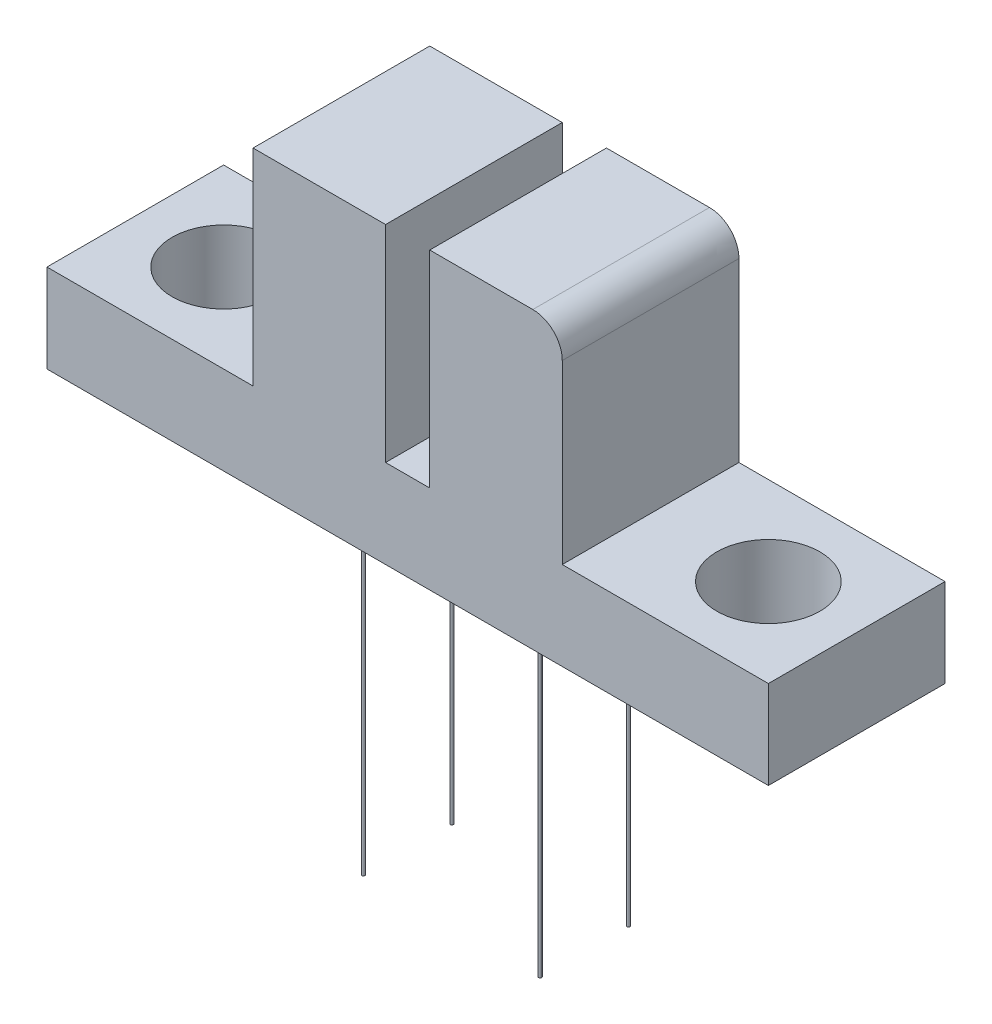
ISO-10303-21;
HEADER;
FILE_DESCRIPTION(('STEP AP214'),'2;1');
FILE_NAME('part.step','',(''),(''),'','','');
FILE_SCHEMA(('AUTOMOTIVE_DESIGN { 1 0 10303 214 1 1 1 1 }'));
ENDSEC;
DATA;
#1=APPLICATION_CONTEXT('core data for automotive mechanical design processes');
#2=APPLICATION_PROTOCOL_DEFINITION('international standard','automotive_design',2000,#1);
#3=PRODUCT_CONTEXT('',#1,'mechanical');
#4=PRODUCT('Part','Part','',(#3));
#5=PRODUCT_RELATED_PRODUCT_CATEGORY('part','',(#4));
#6=PRODUCT_DEFINITION_FORMATION('','',#4);
#7=PRODUCT_DEFINITION_CONTEXT('part definition',#1,'design');
#8=PRODUCT_DEFINITION('design','',#6,#7);
#9=PRODUCT_DEFINITION_SHAPE('','',#8);
#10=(LENGTH_UNIT() NAMED_UNIT(*) SI_UNIT(.MILLI.,.METRE.));
#11=(NAMED_UNIT(*) PLANE_ANGLE_UNIT() SI_UNIT($,.RADIAN.));
#12=(NAMED_UNIT(*) SI_UNIT($,.STERADIAN.) SOLID_ANGLE_UNIT());
#13=UNCERTAINTY_MEASURE_WITH_UNIT(LENGTH_MEASURE(1.E-05),#10,'distance_accuracy_value','');
#14=(GEOMETRIC_REPRESENTATION_CONTEXT(3) GLOBAL_UNCERTAINTY_ASSIGNED_CONTEXT((#13)) GLOBAL_UNIT_ASSIGNED_CONTEXT((#10,
#11,#12)) REPRESENTATION_CONTEXT('',''));
#15=CARTESIAN_POINT('',(0.,0.,0.));
#16=DIRECTION('',(0.,0.,1.));
#17=DIRECTION('',(1.,0.,0.));
#18=AXIS2_PLACEMENT_3D('',#15,#16,#17);
#19=CARTESIAN_POINT('',(0.,3.,0.));
#20=DIRECTION('',(0.,-1.,0.));
#21=DIRECTION('',(0.,0.,-1.));
#22=AXIS2_PLACEMENT_3D('',#19,#20,#21);
#23=PLANE('',#22);
#24=CARTESIAN_POINT('',(-3.,3.,3.));
#25=DIRECTION('',(0.,1.,0.));
#26=DIRECTION('',(0.,0.,-1.));
#27=AXIS2_PLACEMENT_3D('',#24,#25,#26);
#28=CIRCLE('',#27,1.75);
#29=CARTESIAN_POINT('',(-3.,3.,1.25));
#30=VERTEX_POINT('',#29);
#31=EDGE_CURVE('E285',#30,#30,#28,.T.);
#32=ORIENTED_EDGE('',*,*,#31,.F.);
#33=EDGE_LOOP('',(#32));
#34=FACE_BOUND('',#33,.T.);
#35=DIRECTION('',(0.,0.,-1.));
#36=VECTOR('',#35,1.);
#37=CARTESIAN_POINT('',(-7.00000000000001,3.,0.));
#38=LINE('',#37,#36);
#39=CARTESIAN_POINT('',(-7.00000000000001,3.,6.));
#40=VERTEX_POINT('',#39);
#41=CARTESIAN_POINT('',(-7.00000000000001,3.,0.));
#42=VERTEX_POINT('',#41);
#43=EDGE_CURVE('E179',#40,#42,#38,.T.);
#44=ORIENTED_EDGE('',*,*,#43,.F.);
#45=DIRECTION('',(1.,0.,0.));
#46=VECTOR('',#45,1.);
#47=CARTESIAN_POINT('',(0.,3.,6.));
#48=LINE('',#47,#46);
#49=CARTESIAN_POINT('',(0.,3.,6.));
#50=VERTEX_POINT('',#49);
#51=EDGE_CURVE('E307',#40,#50,#48,.T.);
#52=ORIENTED_EDGE('',*,*,#51,.T.);
#53=DIRECTION('',(0.,0.,-1.));
#54=VECTOR('',#53,1.);
#55=CARTESIAN_POINT('',(0.,3.,0.));
#56=LINE('',#55,#54);
#57=CARTESIAN_POINT('',(0.,3.,0.));
#58=VERTEX_POINT('',#57);
#59=EDGE_CURVE('E297',#50,#58,#56,.T.);
#60=ORIENTED_EDGE('',*,*,#59,.T.);
#61=DIRECTION('',(-1.,0.,0.));
#62=VECTOR('',#61,1.);
#63=CARTESIAN_POINT('',(0.,3.,0.));
#64=LINE('',#63,#62);
#65=EDGE_CURVE('E302',#58,#42,#64,.T.);
#66=ORIENTED_EDGE('',*,*,#65,.T.);
#67=EDGE_LOOP('',(#44,#52,#60,#66));
#68=FACE_BOUND('',#67,.T.);
#69=ADVANCED_FACE('F43',(#34,#68),#23,.F.);
#70=DIRECTION('',(0.,0.,1.));
#71=VECTOR('',#70,1.);
#72=CARTESIAN_POINT('',(-11.5,3.,0.));
#73=LINE('',#72,#71);
#74=CARTESIAN_POINT('',(-11.5,3.,0.));
#75=VERTEX_POINT('',#74);
#76=CARTESIAN_POINT('',(-11.5,3.,6.));
#77=VERTEX_POINT('',#76);
#78=EDGE_CURVE('E153',#75,#77,#73,.T.);
#79=ORIENTED_EDGE('',*,*,#78,.F.);
#80=CARTESIAN_POINT('',(-13.,3.,0.));
#81=VERTEX_POINT('',#80);
#82=EDGE_CURVE('E160',#75,#81,#64,.T.);
#83=ORIENTED_EDGE('',*,*,#82,.T.);
#84=DIRECTION('',(0.,0.,-1.));
#85=VECTOR('',#84,1.);
#86=CARTESIAN_POINT('',(-13.,3.,0.));
#87=LINE('',#86,#85);
#88=CARTESIAN_POINT('',(-13.,3.,6.));
#89=VERTEX_POINT('',#88);
#90=EDGE_CURVE('E262',#89,#81,#87,.T.);
#91=ORIENTED_EDGE('',*,*,#90,.F.);
#92=EDGE_CURVE('E311',#89,#77,#48,.T.);
#93=ORIENTED_EDGE('',*,*,#92,.T.);
#94=EDGE_LOOP('',(#79,#83,#91,#93));
#95=FACE_BOUND('',#94,.T.);
#96=ADVANCED_FACE('F347',(#95),#23,.F.);
#97=CARTESIAN_POINT('',(-21.5,3.,3.));
#98=DIRECTION('',(0.,1.,0.));
#99=DIRECTION('',(0.,0.,1.));
#100=AXIS2_PLACEMENT_3D('',#97,#98,#99);
#101=CIRCLE('',#100,1.75);
#102=CARTESIAN_POINT('',(-21.5,3.,4.75));
#103=VERTEX_POINT('',#102);
#104=EDGE_CURVE('E291',#103,#103,#101,.T.);
#105=ORIENTED_EDGE('',*,*,#104,.F.);
#106=EDGE_LOOP('',(#105));
#107=FACE_BOUND('',#106,.T.);
#108=DIRECTION('',(0.,0.,1.));
#109=VECTOR('',#108,1.);
#110=CARTESIAN_POINT('',(-17.5,3.,0.));
#111=LINE('',#110,#109);
#112=CARTESIAN_POINT('',(-17.5,3.,0.));
#113=VERTEX_POINT('',#112);
#114=CARTESIAN_POINT('',(-17.5,3.,6.));
#115=VERTEX_POINT('',#114);
#116=EDGE_CURVE('E269',#113,#115,#111,.T.);
#117=ORIENTED_EDGE('',*,*,#116,.F.);
#118=CARTESIAN_POINT('',(-24.5,3.,0.));
#119=VERTEX_POINT('',#118);
#120=EDGE_CURVE('E300',#113,#119,#64,.T.);
#121=ORIENTED_EDGE('',*,*,#120,.T.);
#122=DIRECTION('',(0.,0.,1.));
#123=VECTOR('',#122,1.);
#124=CARTESIAN_POINT('',(-24.5,3.,0.));
#125=LINE('',#124,#123);
#126=CARTESIAN_POINT('',(-24.5,3.,6.));
#127=VERTEX_POINT('',#126);
#128=EDGE_CURVE('E305',#119,#127,#125,.T.);
#129=ORIENTED_EDGE('',*,*,#128,.T.);
#130=EDGE_CURVE('E308',#127,#115,#48,.T.);
#131=ORIENTED_EDGE('',*,*,#130,.T.);
#132=EDGE_LOOP('',(#117,#121,#129,#131));
#133=FACE_BOUND('',#132,.T.);
#134=ADVANCED_FACE('F343',(#107,#133),#23,.F.);
#135=CARTESIAN_POINT('',(0.,0.,0.));
#136=DIRECTION('',(0.,-1.,0.));
#137=DIRECTION('',(0.,0.,-1.));
#138=AXIS2_PLACEMENT_3D('',#135,#136,#137);
#139=PLANE('',#138);
#140=CARTESIAN_POINT('',(-9.25000000000001,0.,1.5));
#141=DIRECTION('',(0.,-1.,0.));
#142=DIRECTION('',(0.,0.,-1.));
#143=AXIS2_PLACEMENT_3D('',#140,#141,#142);
#144=CIRCLE('',#143,0.0499999999999988);
#145=CARTESIAN_POINT('',(-9.25000000000001,0.,1.45));
#146=VERTEX_POINT('',#145);
#147=EDGE_CURVE('E533',#146,#146,#144,.T.);
#148=ORIENTED_EDGE('',*,*,#147,.F.);
#149=EDGE_LOOP('',(#148));
#150=FACE_BOUND('',#149,.T.);
#151=CARTESIAN_POINT('',(-9.25000000000001,0.,4.5));
#152=DIRECTION('',(0.,-1.,0.));
#153=DIRECTION('',(0.,0.,1.));
#154=AXIS2_PLACEMENT_3D('',#151,#152,#153);
#155=CIRCLE('',#154,0.0499999999999988);
#156=CARTESIAN_POINT('',(-9.25000000000001,0.,4.55));
#157=VERTEX_POINT('',#156);
#158=EDGE_CURVE('E532',#157,#157,#155,.T.);
#159=ORIENTED_EDGE('',*,*,#158,.F.);
#160=EDGE_LOOP('',(#159));
#161=FACE_BOUND('',#160,.T.);
#162=CARTESIAN_POINT('',(-15.25,0.,4.5));
#163=DIRECTION('',(0.,-1.,0.));
#164=DIRECTION('',(0.,0.,-1.));
#165=AXIS2_PLACEMENT_3D('',#162,#163,#164);
#166=CIRCLE('',#165,0.0499999999999988);
#167=CARTESIAN_POINT('',(-15.25,0.,4.45));
#168=VERTEX_POINT('',#167);
#169=EDGE_CURVE('E542',#168,#168,#166,.T.);
#170=ORIENTED_EDGE('',*,*,#169,.F.);
#171=EDGE_LOOP('',(#170));
#172=FACE_BOUND('',#171,.T.);
#173=CARTESIAN_POINT('',(-15.25,0.,1.5));
#174=DIRECTION('',(0.,-1.,0.));
#175=DIRECTION('',(0.,0.,1.));
#176=AXIS2_PLACEMENT_3D('',#173,#174,#175);
#177=CIRCLE('',#176,0.0499999999999988);
#178=CARTESIAN_POINT('',(-15.25,0.,1.55));
#179=VERTEX_POINT('',#178);
#180=EDGE_CURVE('E547',#179,#179,#177,.T.);
#181=ORIENTED_EDGE('',*,*,#180,.F.);
#182=EDGE_LOOP('',(#181));
#183=FACE_BOUND('',#182,.T.);
#184=CARTESIAN_POINT('',(-21.5,0.,3.));
#185=DIRECTION('',(0.,1.,0.));
#186=DIRECTION('',(0.,0.,1.));
#187=AXIS2_PLACEMENT_3D('',#184,#185,#186);
#188=CIRCLE('',#187,1.75);
#189=CARTESIAN_POINT('',(-21.5,0.,4.75));
#190=VERTEX_POINT('',#189);
#191=EDGE_CURVE('E288',#190,#190,#188,.T.);
#192=ORIENTED_EDGE('',*,*,#191,.T.);
#193=EDGE_LOOP('',(#192));
#194=FACE_BOUND('',#193,.T.);
#195=DIRECTION('',(0.,0.,-1.));
#196=VECTOR('',#195,1.);
#197=CARTESIAN_POINT('',(0.,0.,0.));
#198=LINE('',#197,#196);
#199=CARTESIAN_POINT('',(0.,0.,6.));
#200=VERTEX_POINT('',#199);
#201=CARTESIAN_POINT('',(0.,0.,0.));
#202=VERTEX_POINT('',#201);
#203=EDGE_CURVE('E294',#200,#202,#198,.T.);
#204=ORIENTED_EDGE('',*,*,#203,.F.);
#205=DIRECTION('',(1.,0.,0.));
#206=VECTOR('',#205,1.);
#207=CARTESIAN_POINT('',(0.,0.,6.));
#208=LINE('',#207,#206);
#209=CARTESIAN_POINT('',(-24.5,0.,6.));
#210=VERTEX_POINT('',#209);
#211=EDGE_CURVE('E301',#210,#200,#208,.T.);
#212=ORIENTED_EDGE('',*,*,#211,.F.);
#213=DIRECTION('',(0.,0.,1.));
#214=VECTOR('',#213,1.);
#215=CARTESIAN_POINT('',(-24.5,0.,0.));
#216=LINE('',#215,#214);
#217=CARTESIAN_POINT('',(-24.5,0.,0.));
#218=VERTEX_POINT('',#217);
#219=EDGE_CURVE('E316',#218,#210,#216,.T.);
#220=ORIENTED_EDGE('',*,*,#219,.F.);
#221=DIRECTION('',(-1.,0.,0.));
#222=VECTOR('',#221,1.);
#223=CARTESIAN_POINT('',(0.,0.,0.));
#224=LINE('',#223,#222);
#225=EDGE_CURVE('E314',#202,#218,#224,.T.);
#226=ORIENTED_EDGE('',*,*,#225,.F.);
#227=EDGE_LOOP('',(#204,#212,#220,#226));
#228=FACE_BOUND('',#227,.T.);
#229=CARTESIAN_POINT('',(-3.,0.,3.));
#230=DIRECTION('',(0.,1.,0.));
#231=DIRECTION('',(0.,0.,-1.));
#232=AXIS2_PLACEMENT_3D('',#229,#230,#231);
#233=CIRCLE('',#232,1.75);
#234=CARTESIAN_POINT('',(-3.,0.,1.25));
#235=VERTEX_POINT('',#234);
#236=EDGE_CURVE('E284',#235,#235,#233,.T.);
#237=ORIENTED_EDGE('',*,*,#236,.T.);
#238=EDGE_LOOP('',(#237));
#239=FACE_BOUND('',#238,.T.);
#240=ADVANCED_FACE('F237',(#150,#161,#172,#183,#194,#228,#239),#139,.T.);
#241=CARTESIAN_POINT('',(0.,3.,0.));
#242=DIRECTION('',(-1.,0.,0.));
#243=DIRECTION('',(0.,0.,1.));
#244=AXIS2_PLACEMENT_3D('',#241,#242,#243);
#245=PLANE('',#244);
#246=ORIENTED_EDGE('',*,*,#203,.T.);
#247=DIRECTION('',(0.,-1.,0.));
#248=VECTOR('',#247,1.);
#249=CARTESIAN_POINT('',(0.,3.,0.));
#250=LINE('',#249,#248);
#251=EDGE_CURVE('E326',#58,#202,#250,.T.);
#252=ORIENTED_EDGE('',*,*,#251,.F.);
#253=ORIENTED_EDGE('',*,*,#59,.F.);
#254=DIRECTION('',(0.,-1.,0.));
#255=VECTOR('',#254,1.);
#256=CARTESIAN_POINT('',(0.,3.,6.));
#257=LINE('',#256,#255);
#258=EDGE_CURVE('E310',#50,#200,#257,.T.);
#259=ORIENTED_EDGE('',*,*,#258,.T.);
#260=EDGE_LOOP('',(#246,#252,#253,#259));
#261=FACE_BOUND('',#260,.T.);
#262=ADVANCED_FACE('F244',(#261),#245,.F.);
#263=CARTESIAN_POINT('',(0.,3.,0.));
#264=DIRECTION('',(0.,0.,1.));
#265=DIRECTION('',(1.,0.,0.));
#266=AXIS2_PLACEMENT_3D('',#263,#264,#265);
#267=PLANE('',#266);
#268=DIRECTION('',(-1.,0.,0.));
#269=VECTOR('',#268,1.);
#270=CARTESIAN_POINT('',(-7.00000000000001,10.,0.));
#271=LINE('',#270,#269);
#272=CARTESIAN_POINT('',(-8.00000000000001,10.,0.));
#273=VERTEX_POINT('',#272);
#274=CARTESIAN_POINT('',(-11.5,10.,0.));
#275=VERTEX_POINT('',#274);
#276=EDGE_CURVE('E143',#273,#275,#271,.T.);
#277=ORIENTED_EDGE('',*,*,#276,.F.);
#278=CARTESIAN_POINT('',(-7.00000000000001,9.,0.));
#279=CARTESIAN_POINT('',(-7.00000000000001,10.,0.));
#280=CARTESIAN_POINT('',(-8.00000000000001,10.,0.));
#281=(BOUNDED_CURVE() B_SPLINE_CURVE(2,(#278,#279,#280),.UNSPECIFIED.,.F.,
.F.) B_SPLINE_CURVE_WITH_KNOTS((3,3),(0.,1.),
.UNSPECIFIED.) CURVE() GEOMETRIC_REPRESENTATION_ITEM() RATIONAL_B_SPLINE_CURVE((1.,
0.707106781186548,1.)) REPRESENTATION_ITEM(''));
#282=CARTESIAN_POINT('',(-7.00000000000001,9.,0.));
#283=VERTEX_POINT('',#282);
#284=EDGE_CURVE('E72',#273,#283,#281,.F.);
#285=ORIENTED_EDGE('',*,*,#284,.T.);
#286=DIRECTION('',(0.,-1.,0.));
#287=VECTOR('',#286,1.);
#288=CARTESIAN_POINT('',(-7.00000000000001,10.,0.));
#289=LINE('',#288,#287);
#290=EDGE_CURVE('E163',#283,#42,#289,.T.);
#291=ORIENTED_EDGE('',*,*,#290,.T.);
#292=ORIENTED_EDGE('',*,*,#65,.F.);
#293=ORIENTED_EDGE('',*,*,#251,.T.);
#294=ORIENTED_EDGE('',*,*,#225,.T.);
#295=DIRECTION('',(0.,-1.,0.));
#296=VECTOR('',#295,1.);
#297=CARTESIAN_POINT('',(-24.5,3.,0.));
#298=LINE('',#297,#296);
#299=EDGE_CURVE('E324',#119,#218,#298,.T.);
#300=ORIENTED_EDGE('',*,*,#299,.F.);
#301=ORIENTED_EDGE('',*,*,#120,.F.);
#302=DIRECTION('',(0.,-1.,0.));
#303=VECTOR('',#302,1.);
#304=CARTESIAN_POINT('',(-17.5,10.,0.));
#305=LINE('',#304,#303);
#306=CARTESIAN_POINT('',(-17.5,10.,0.));
#307=VERTEX_POINT('',#306);
#308=EDGE_CURVE('E268',#307,#113,#305,.T.);
#309=ORIENTED_EDGE('',*,*,#308,.F.);
#310=DIRECTION('',(-1.,0.,0.));
#311=VECTOR('',#310,1.);
#312=CARTESIAN_POINT('',(-17.5,10.,0.));
#313=LINE('',#312,#311);
#314=CARTESIAN_POINT('',(-13.,10.,0.));
#315=VERTEX_POINT('',#314);
#316=EDGE_CURVE('E266',#315,#307,#313,.T.);
#317=ORIENTED_EDGE('',*,*,#316,.F.);
#318=DIRECTION('',(0.,-1.,0.));
#319=VECTOR('',#318,1.);
#320=CARTESIAN_POINT('',(-13.,10.,0.));
#321=LINE('',#320,#319);
#322=EDGE_CURVE('E276',#315,#81,#321,.T.);
#323=ORIENTED_EDGE('',*,*,#322,.T.);
#324=ORIENTED_EDGE('',*,*,#82,.F.);
#325=DIRECTION('',(0.,-1.,0.));
#326=VECTOR('',#325,1.);
#327=CARTESIAN_POINT('',(-11.5,10.,0.));
#328=LINE('',#327,#326);
#329=EDGE_CURVE('E157',#275,#75,#328,.T.);
#330=ORIENTED_EDGE('',*,*,#329,.F.);
#331=EDGE_LOOP('',(#277,#285,#291,#292,#293,#294,#300,#301,#309,#317,#323,#324,#330));
#332=FACE_BOUND('',#331,.T.);
#333=ADVANCED_FACE('F158',(#332),#267,.F.);
#334=CARTESIAN_POINT('',(-24.5,3.,0.));
#335=DIRECTION('',(1.,0.,0.));
#336=DIRECTION('',(0.,0.,-1.));
#337=AXIS2_PLACEMENT_3D('',#334,#335,#336);
#338=PLANE('',#337);
#339=ORIENTED_EDGE('',*,*,#219,.T.);
#340=DIRECTION('',(0.,-1.,0.));
#341=VECTOR('',#340,1.);
#342=CARTESIAN_POINT('',(-24.5,3.,6.));
#343=LINE('',#342,#341);
#344=EDGE_CURVE('E321',#127,#210,#343,.T.);
#345=ORIENTED_EDGE('',*,*,#344,.F.);
#346=ORIENTED_EDGE('',*,*,#128,.F.);
#347=ORIENTED_EDGE('',*,*,#299,.T.);
#348=EDGE_LOOP('',(#339,#345,#346,#347));
#349=FACE_BOUND('',#348,.T.);
#350=ADVANCED_FACE('F236',(#349),#338,.F.);
#351=CARTESIAN_POINT('',(0.,3.,6.));
#352=DIRECTION('',(0.,0.,-1.));
#353=DIRECTION('',(-1.,0.,0.));
#354=AXIS2_PLACEMENT_3D('',#351,#352,#353);
#355=PLANE('',#354);
#356=DIRECTION('',(0.,-1.,0.));
#357=VECTOR('',#356,1.);
#358=CARTESIAN_POINT('',(-7.00000000000001,10.,6.));
#359=LINE('',#358,#357);
#360=CARTESIAN_POINT('',(-7.00000000000001,9.,6.));
#361=VERTEX_POINT('',#360);
#362=EDGE_CURVE('E171',#361,#40,#359,.T.);
#363=ORIENTED_EDGE('',*,*,#362,.F.);
#364=CARTESIAN_POINT('',(-8.00000000000001,10.,6.));
#365=CARTESIAN_POINT('',(-7.,10.,5.99999999999999));
#366=CARTESIAN_POINT('',(-7.00000000000001,9.,6.));
#367=(BOUNDED_CURVE() B_SPLINE_CURVE(2,(#364,#365,#366),.UNSPECIFIED.,.F.,
.F.) B_SPLINE_CURVE_WITH_KNOTS((3,3),(0.,1.),
.UNSPECIFIED.) CURVE() GEOMETRIC_REPRESENTATION_ITEM() RATIONAL_B_SPLINE_CURVE((1.,
0.707106781186548,1.)) REPRESENTATION_ITEM(''));
#368=CARTESIAN_POINT('',(-8.00000000000001,10.,6.));
#369=VERTEX_POINT('',#368);
#370=EDGE_CURVE('E12',#361,#369,#367,.F.);
#371=ORIENTED_EDGE('',*,*,#370,.T.);
#372=DIRECTION('',(1.,0.,0.));
#373=VECTOR('',#372,1.);
#374=CARTESIAN_POINT('',(-7.00000000000001,10.,6.));
#375=LINE('',#374,#373);
#376=CARTESIAN_POINT('',(-11.5,10.,6.));
#377=VERTEX_POINT('',#376);
#378=EDGE_CURVE('E169',#377,#369,#375,.T.);
#379=ORIENTED_EDGE('',*,*,#378,.F.);
#380=DIRECTION('',(0.,-1.,0.));
#381=VECTOR('',#380,1.);
#382=CARTESIAN_POINT('',(-11.5,10.,6.));
#383=LINE('',#382,#381);
#384=EDGE_CURVE('E164',#377,#77,#383,.T.);
#385=ORIENTED_EDGE('',*,*,#384,.T.);
#386=ORIENTED_EDGE('',*,*,#92,.F.);
#387=DIRECTION('',(0.,-1.,0.));
#388=VECTOR('',#387,1.);
#389=CARTESIAN_POINT('',(-13.,10.,6.));
#390=LINE('',#389,#388);
#391=CARTESIAN_POINT('',(-13.,10.,6.));
#392=VERTEX_POINT('',#391);
#393=EDGE_CURVE('E278',#392,#89,#390,.T.);
#394=ORIENTED_EDGE('',*,*,#393,.F.);
#395=DIRECTION('',(1.,0.,0.));
#396=VECTOR('',#395,1.);
#397=CARTESIAN_POINT('',(-17.5,10.,6.));
#398=LINE('',#397,#396);
#399=CARTESIAN_POINT('',(-17.5,10.,6.));
#400=VERTEX_POINT('',#399);
#401=EDGE_CURVE('E261',#400,#392,#398,.T.);
#402=ORIENTED_EDGE('',*,*,#401,.F.);
#403=DIRECTION('',(0.,-1.,0.));
#404=VECTOR('',#403,1.);
#405=CARTESIAN_POINT('',(-17.5,10.,6.));
#406=LINE('',#405,#404);
#407=EDGE_CURVE('E281',#400,#115,#406,.T.);
#408=ORIENTED_EDGE('',*,*,#407,.T.);
#409=ORIENTED_EDGE('',*,*,#130,.F.);
#410=ORIENTED_EDGE('',*,*,#344,.T.);
#411=ORIENTED_EDGE('',*,*,#211,.T.);
#412=ORIENTED_EDGE('',*,*,#258,.F.);
#413=ORIENTED_EDGE('',*,*,#51,.F.);
#414=EDGE_LOOP('',(#363,#371,#379,#385,#386,#394,#402,#408,#409,#410,#411,#412,#413));
#415=FACE_BOUND('',#414,.T.);
#416=ADVANCED_FACE('F225',(#415),#355,.F.);
#417=CARTESIAN_POINT('',(-21.5,3.,3.));
#418=DIRECTION('',(0.,-1.,0.));
#419=DIRECTION('',(0.,0.,-1.));
#420=AXIS2_PLACEMENT_3D('',#417,#418,#419);
#421=CYLINDRICAL_SURFACE('',#420,1.75);
#422=ORIENTED_EDGE('',*,*,#104,.T.);
#423=EDGE_LOOP('',(#422));
#424=FACE_BOUND('',#423,.T.);
#425=ORIENTED_EDGE('',*,*,#191,.F.);
#426=EDGE_LOOP('',(#425));
#427=FACE_BOUND('',#426,.T.);
#428=ADVANCED_FACE('F235',(#424,#427),#421,.F.);
#429=CARTESIAN_POINT('',(-3.,3.,3.));
#430=DIRECTION('',(0.,-1.,0.));
#431=DIRECTION('',(0.,0.,-1.));
#432=AXIS2_PLACEMENT_3D('',#429,#430,#431);
#433=CYLINDRICAL_SURFACE('',#432,1.75);
#434=ORIENTED_EDGE('',*,*,#31,.T.);
#435=EDGE_LOOP('',(#434));
#436=FACE_BOUND('',#435,.T.);
#437=ORIENTED_EDGE('',*,*,#236,.F.);
#438=EDGE_LOOP('',(#437));
#439=FACE_BOUND('',#438,.T.);
#440=ADVANCED_FACE('F411',(#436,#439),#433,.F.);
#441=CARTESIAN_POINT('',(-17.5,10.,0.));
#442=DIRECTION('',(1.,0.,0.));
#443=DIRECTION('',(0.,0.,-1.));
#444=AXIS2_PLACEMENT_3D('',#441,#442,#443);
#445=PLANE('',#444);
#446=ORIENTED_EDGE('',*,*,#116,.T.);
#447=ORIENTED_EDGE('',*,*,#407,.F.);
#448=DIRECTION('',(0.,0.,1.));
#449=VECTOR('',#448,1.);
#450=CARTESIAN_POINT('',(-17.5,10.,0.));
#451=LINE('',#450,#449);
#452=EDGE_CURVE('E258',#307,#400,#451,.T.);
#453=ORIENTED_EDGE('',*,*,#452,.F.);
#454=ORIENTED_EDGE('',*,*,#308,.T.);
#455=EDGE_LOOP('',(#446,#447,#453,#454));
#456=FACE_BOUND('',#455,.T.);
#457=ADVANCED_FACE('F417',(#456),#445,.F.);
#458=CARTESIAN_POINT('',(-13.,10.,0.));
#459=DIRECTION('',(-1.,0.,0.));
#460=DIRECTION('',(0.,0.,1.));
#461=AXIS2_PLACEMENT_3D('',#458,#459,#460);
#462=PLANE('',#461);
#463=ORIENTED_EDGE('',*,*,#90,.T.);
#464=ORIENTED_EDGE('',*,*,#322,.F.);
#465=DIRECTION('',(0.,0.,-1.));
#466=VECTOR('',#465,1.);
#467=CARTESIAN_POINT('',(-13.,10.,0.));
#468=LINE('',#467,#466);
#469=EDGE_CURVE('E264',#392,#315,#468,.T.);
#470=ORIENTED_EDGE('',*,*,#469,.F.);
#471=ORIENTED_EDGE('',*,*,#393,.T.);
#472=EDGE_LOOP('',(#463,#464,#470,#471));
#473=FACE_BOUND('',#472,.T.);
#474=ADVANCED_FACE('F351',(#473),#462,.F.);
#475=CARTESIAN_POINT('',(0.,10.,0.));
#476=DIRECTION('',(0.,1.,0.));
#477=DIRECTION('',(0.,0.,1.));
#478=AXIS2_PLACEMENT_3D('',#475,#476,#477);
#479=PLANE('',#478);
#480=ORIENTED_EDGE('',*,*,#452,.T.);
#481=ORIENTED_EDGE('',*,*,#401,.T.);
#482=ORIENTED_EDGE('',*,*,#469,.T.);
#483=ORIENTED_EDGE('',*,*,#316,.T.);
#484=EDGE_LOOP('',(#480,#481,#482,#483));
#485=FACE_BOUND('',#484,.T.);
#486=ADVANCED_FACE('F205',(#485),#479,.T.);
#487=CARTESIAN_POINT('',(-7.00000000000001,10.,0.));
#488=DIRECTION('',(-1.,0.,0.));
#489=DIRECTION('',(0.,0.,1.));
#490=AXIS2_PLACEMENT_3D('',#487,#488,#489);
#491=PLANE('',#490);
#492=ORIENTED_EDGE('',*,*,#290,.F.);
#493=CARTESIAN_POINT('',(-7.00000000000001,9.,6.3));
#494=CARTESIAN_POINT('',(-7.00000000000001,9.,4.09999999999999));
#495=CARTESIAN_POINT('',(-7.00000000000001,9.,1.9));
#496=CARTESIAN_POINT('',(-7.00000000000001,9.,-0.300000000000002));
#497=(BOUNDED_CURVE() B_SPLINE_CURVE(3,(#493,#494,#495,#496),.UNSPECIFIED.,.F.,
.F.) B_SPLINE_CURVE_WITH_KNOTS((4,4),(-0.00629999999999999,0.000300000000000009),
.UNSPECIFIED.) CURVE() GEOMETRIC_REPRESENTATION_ITEM() RATIONAL_B_SPLINE_CURVE((1.,1.,1.,1.)) REPRESENTATION_ITEM(''));
#498=EDGE_CURVE('E57',#283,#361,#497,.F.);
#499=ORIENTED_EDGE('',*,*,#498,.T.);
#500=ORIENTED_EDGE('',*,*,#362,.T.);
#501=ORIENTED_EDGE('',*,*,#43,.T.);
#502=EDGE_LOOP('',(#492,#499,#500,#501));
#503=FACE_BOUND('',#502,.T.);
#504=ADVANCED_FACE('F201',(#503),#491,.F.);
#505=CARTESIAN_POINT('',(-11.5,10.,0.));
#506=DIRECTION('',(1.,0.,0.));
#507=DIRECTION('',(0.,0.,-1.));
#508=AXIS2_PLACEMENT_3D('',#505,#506,#507);
#509=PLANE('',#508);
#510=ORIENTED_EDGE('',*,*,#78,.T.);
#511=ORIENTED_EDGE('',*,*,#384,.F.);
#512=DIRECTION('',(0.,0.,1.));
#513=VECTOR('',#512,1.);
#514=CARTESIAN_POINT('',(-11.5,10.,0.));
#515=LINE('',#514,#513);
#516=EDGE_CURVE('E148',#275,#377,#515,.T.);
#517=ORIENTED_EDGE('',*,*,#516,.F.);
#518=ORIENTED_EDGE('',*,*,#329,.T.);
#519=EDGE_LOOP('',(#510,#511,#517,#518));
#520=FACE_BOUND('',#519,.T.);
#521=ADVANCED_FACE('F166',(#520),#509,.F.);
#522=CARTESIAN_POINT('',(0.,10.,0.));
#523=DIRECTION('',(0.,-1.,0.));
#524=DIRECTION('',(0.,0.,-1.));
#525=AXIS2_PLACEMENT_3D('',#522,#523,#524);
#526=PLANE('',#525);
#527=ORIENTED_EDGE('',*,*,#378,.T.);
#528=CARTESIAN_POINT('',(-8.00000000000001,10.,-0.3));
#529=CARTESIAN_POINT('',(-8.00000000000001,10.,1.9));
#530=CARTESIAN_POINT('',(-8.00000000000001,10.,4.09999999999999));
#531=CARTESIAN_POINT('',(-8.00000000000001,10.,6.3));
#532=(BOUNDED_CURVE() B_SPLINE_CURVE(3,(#528,#529,#530,#531),.UNSPECIFIED.,.F.,
.F.) B_SPLINE_CURVE_WITH_KNOTS((4,4),(-0.00629999999999999,0.000300000000000009),
.UNSPECIFIED.) CURVE() GEOMETRIC_REPRESENTATION_ITEM() RATIONAL_B_SPLINE_CURVE((1.,1.,1.,1.)) REPRESENTATION_ITEM(''));
#533=EDGE_CURVE('E151',#369,#273,#532,.F.);
#534=ORIENTED_EDGE('',*,*,#533,.T.);
#535=ORIENTED_EDGE('',*,*,#276,.T.);
#536=ORIENTED_EDGE('',*,*,#516,.T.);
#537=EDGE_LOOP('',(#527,#534,#535,#536));
#538=FACE_BOUND('',#537,.T.);
#539=ADVANCED_FACE('F146',(#538),#526,.F.);
#540=CARTESIAN_POINT('',(-8.00000000000001,10.,6.3));
#541=CARTESIAN_POINT('',(-8.00000000000001,10.,4.09999999999999));
#542=CARTESIAN_POINT('',(-8.00000000000001,10.,1.9));
#543=CARTESIAN_POINT('',(-8.00000000000001,10.,-0.3));
#544=CARTESIAN_POINT('',(-7.00000000000001,10.,6.3));
#545=CARTESIAN_POINT('',(-7.00000000000001,10.,4.1));
#546=CARTESIAN_POINT('',(-7.00000000000001,10.,1.89999999999999));
#547=CARTESIAN_POINT('',(-7.00000000000001,10.,-0.300000000000002));
#548=CARTESIAN_POINT('',(-7.00000000000001,9.,6.3));
#549=CARTESIAN_POINT('',(-7.00000000000001,9.,4.09999999999999));
#550=CARTESIAN_POINT('',(-7.00000000000001,9.,1.9));
#551=CARTESIAN_POINT('',(-7.00000000000001,9.,-0.300000000000002));
#552=(BOUNDED_SURFACE() B_SPLINE_SURFACE(2,3,((#540,#541,#542,#543),(#544,#545,#546,#547),(#548,
#549,#550,#551)),.UNSPECIFIED.,.F.,.F.,.F.) B_SPLINE_SURFACE_WITH_KNOTS((3,3),(4,4),(0.,1.),
(-0.00629999999999999,0.000300000000000009),
.UNSPECIFIED.) GEOMETRIC_REPRESENTATION_ITEM() RATIONAL_B_SPLINE_SURFACE(((1.,1.,1.,1.),
(0.707106781186548,0.707106781186548,0.707106781186548,0.707106781186548),(1.,1.,1.,1.))) REPRESENTATION_ITEM('') SURFACE());
#553=ORIENTED_EDGE('',*,*,#370,.F.);
#554=ORIENTED_EDGE('',*,*,#498,.F.);
#555=ORIENTED_EDGE('',*,*,#284,.F.);
#556=ORIENTED_EDGE('',*,*,#533,.F.);
#557=EDGE_LOOP('',(#553,#554,#555,#556));
#558=FACE_BOUND('',#557,.T.);
#559=ADVANCED_FACE('F46',(#558),#552,.T.);
#560=CARTESIAN_POINT('',(-15.25,-11.,1.5));
#561=DIRECTION('',(0.,1.,0.));
#562=DIRECTION('',(0.,0.,1.));
#563=AXIS2_PLACEMENT_3D('',#560,#561,#562);
#564=CYLINDRICAL_SURFACE('',#563,0.0499999999999988);
#565=CARTESIAN_POINT('',(-15.25,-11.,1.5));
#566=DIRECTION('',(0.,-1.,0.));
#567=DIRECTION('',(0.,0.,1.));
#568=AXIS2_PLACEMENT_3D('',#565,#566,#567);
#569=CIRCLE('',#568,0.0499999999999988);
#570=CARTESIAN_POINT('',(-15.25,-11.,1.55));
#571=VERTEX_POINT('',#570);
#572=EDGE_CURVE('E550',#571,#571,#569,.T.);
#573=ORIENTED_EDGE('',*,*,#572,.F.);
#574=EDGE_LOOP('',(#573));
#575=FACE_BOUND('',#574,.T.);
#576=ORIENTED_EDGE('',*,*,#180,.T.);
#577=EDGE_LOOP('',(#576));
#578=FACE_BOUND('',#577,.T.);
#579=ADVANCED_FACE('F197',(#575,#578),#564,.T.);
#580=CARTESIAN_POINT('',(-15.25,-11.,1.5));
#581=DIRECTION('',(0.,1.,0.));
#582=DIRECTION('',(0.,0.,1.));
#583=AXIS2_PLACEMENT_3D('',#580,#581,#582);
#584=PLANE('',#583);
#585=ORIENTED_EDGE('',*,*,#572,.T.);
#586=EDGE_LOOP('',(#585));
#587=FACE_BOUND('',#586,.T.);
#588=ADVANCED_FACE('F391',(#587),#584,.F.);
#589=CARTESIAN_POINT('',(-15.25,-11.,4.5));
#590=DIRECTION('',(0.,1.,0.));
#591=DIRECTION('',(0.,0.,1.));
#592=AXIS2_PLACEMENT_3D('',#589,#590,#591);
#593=CYLINDRICAL_SURFACE('',#592,0.0499999999999988);
#594=CARTESIAN_POINT('',(-15.25,-11.,4.5));
#595=DIRECTION('',(0.,-1.,0.));
#596=DIRECTION('',(0.,0.,-1.));
#597=AXIS2_PLACEMENT_3D('',#594,#595,#596);
#598=CIRCLE('',#597,0.0499999999999988);
#599=CARTESIAN_POINT('',(-15.25,-11.,4.45));
#600=VERTEX_POINT('',#599);
#601=EDGE_CURVE('E544',#600,#600,#598,.T.);
#602=ORIENTED_EDGE('',*,*,#601,.F.);
#603=EDGE_LOOP('',(#602));
#604=FACE_BOUND('',#603,.T.);
#605=ORIENTED_EDGE('',*,*,#169,.T.);
#606=EDGE_LOOP('',(#605));
#607=FACE_BOUND('',#606,.T.);
#608=ADVANCED_FACE('F466',(#604,#607),#593,.T.);
#609=CARTESIAN_POINT('',(-15.25,-11.,4.5));
#610=DIRECTION('',(0.,-1.,0.));
#611=DIRECTION('',(0.,0.,-1.));
#612=AXIS2_PLACEMENT_3D('',#609,#610,#611);
#613=PLANE('',#612);
#614=ORIENTED_EDGE('',*,*,#601,.T.);
#615=EDGE_LOOP('',(#614));
#616=FACE_BOUND('',#615,.T.);
#617=ADVANCED_FACE('F475',(#616),#613,.T.);
#618=CARTESIAN_POINT('',(-9.25000000000001,-11.,4.5));
#619=DIRECTION('',(0.,1.,0.));
#620=DIRECTION('',(0.,0.,1.));
#621=AXIS2_PLACEMENT_3D('',#618,#619,#620);
#622=CYLINDRICAL_SURFACE('',#621,0.0499999999999988);
#623=CARTESIAN_POINT('',(-9.25000000000001,-11.,4.5));
#624=DIRECTION('',(0.,-1.,0.));
#625=DIRECTION('',(0.,0.,1.));
#626=AXIS2_PLACEMENT_3D('',#623,#624,#625);
#627=CIRCLE('',#626,0.0499999999999988);
#628=CARTESIAN_POINT('',(-9.25000000000001,-11.,4.55));
#629=VERTEX_POINT('',#628);
#630=EDGE_CURVE('E536',#629,#629,#627,.T.);
#631=ORIENTED_EDGE('',*,*,#630,.F.);
#632=EDGE_LOOP('',(#631));
#633=FACE_BOUND('',#632,.T.);
#634=ORIENTED_EDGE('',*,*,#158,.T.);
#635=EDGE_LOOP('',(#634));
#636=FACE_BOUND('',#635,.T.);
#637=ADVANCED_FACE('F485',(#633,#636),#622,.T.);
#638=CARTESIAN_POINT('',(-9.25000000000001,-11.,4.5));
#639=DIRECTION('',(0.,1.,0.));
#640=DIRECTION('',(0.,0.,1.));
#641=AXIS2_PLACEMENT_3D('',#638,#639,#640);
#642=PLANE('',#641);
#643=ORIENTED_EDGE('',*,*,#630,.T.);
#644=EDGE_LOOP('',(#643));
#645=FACE_BOUND('',#644,.T.);
#646=ADVANCED_FACE('F495',(#645),#642,.F.);
#647=CARTESIAN_POINT('',(-9.25000000000001,-11.,1.5));
#648=DIRECTION('',(0.,1.,0.));
#649=DIRECTION('',(0.,0.,1.));
#650=AXIS2_PLACEMENT_3D('',#647,#648,#649);
#651=CYLINDRICAL_SURFACE('',#650,0.0499999999999988);
#652=CARTESIAN_POINT('',(-9.25000000000001,-11.,1.5));
#653=DIRECTION('',(0.,-1.,0.));
#654=DIRECTION('',(0.,0.,-1.));
#655=AXIS2_PLACEMENT_3D('',#652,#653,#654);
#656=CIRCLE('',#655,0.0499999999999988);
#657=CARTESIAN_POINT('',(-9.25000000000001,-11.,1.45));
#658=VERTEX_POINT('',#657);
#659=EDGE_CURVE('E531',#658,#658,#656,.T.);
#660=ORIENTED_EDGE('',*,*,#659,.F.);
#661=EDGE_LOOP('',(#660));
#662=FACE_BOUND('',#661,.T.);
#663=ORIENTED_EDGE('',*,*,#147,.T.);
#664=EDGE_LOOP('',(#663));
#665=FACE_BOUND('',#664,.T.);
#666=ADVANCED_FACE('F505',(#662,#665),#651,.T.);
#667=CARTESIAN_POINT('',(-9.25000000000001,-11.,1.5));
#668=DIRECTION('',(0.,-1.,0.));
#669=DIRECTION('',(0.,0.,-1.));
#670=AXIS2_PLACEMENT_3D('',#667,#668,#669);
#671=PLANE('',#670);
#672=ORIENTED_EDGE('',*,*,#659,.T.);
#673=EDGE_LOOP('',(#672));
#674=FACE_BOUND('',#673,.T.);
#675=ADVANCED_FACE('F515',(#674),#671,.T.);
#676=CLOSED_SHELL('',(#69,#96,#134,#240,#262,#333,#350,#416,#428,#440,#457,#474,#486,#504,#521,
#539,#559,#579,#588,#608,#617,#637,#646,#666,#675));
#677=MANIFOLD_SOLID_BREP('B2',#676);
#678=ADVANCED_BREP_SHAPE_REPRESENTATION('',(#18,#677),#14);
#679=SHAPE_DEFINITION_REPRESENTATION(#9,#678);
ENDSEC;
END-ISO-10303-21;
